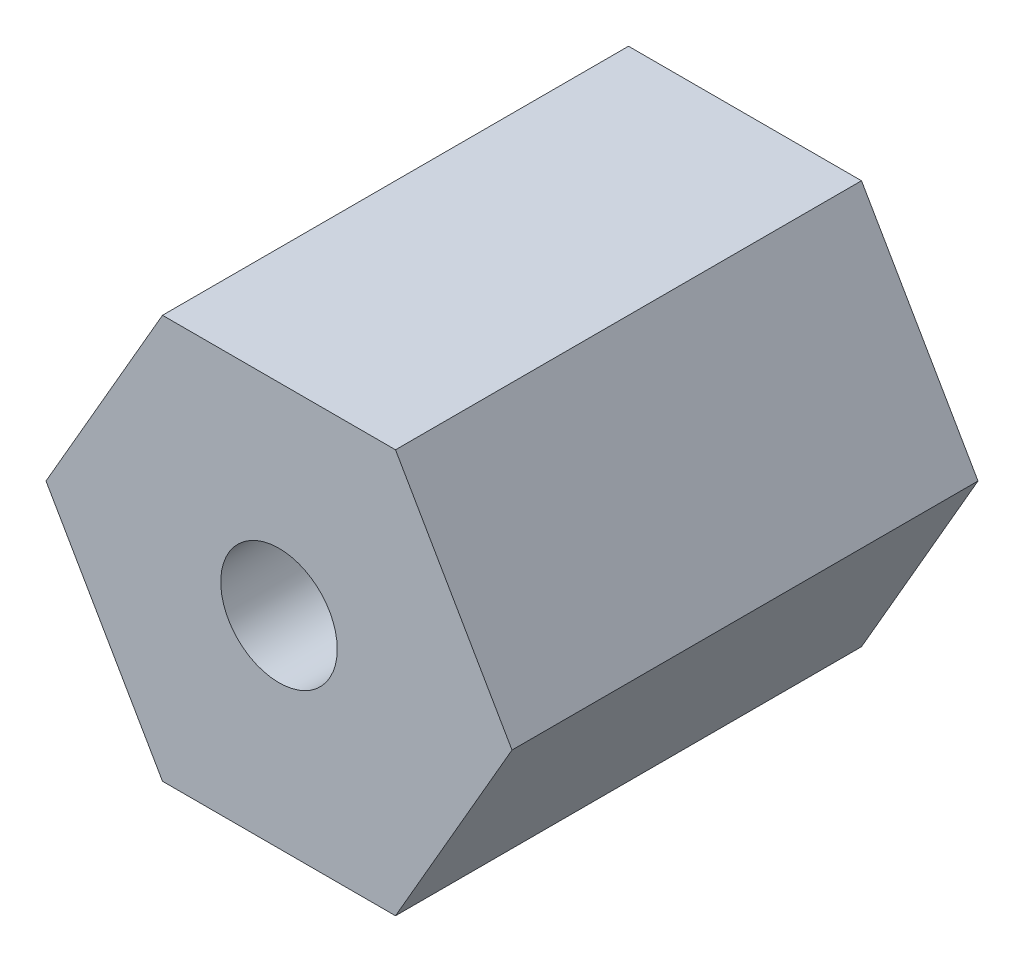
ISO-10303-21;
HEADER;
FILE_DESCRIPTION(('STEP AP214'),'2;1');
FILE_NAME('part.step','',(''),(''),'','','');
FILE_SCHEMA(('AUTOMOTIVE_DESIGN { 1 0 10303 214 1 1 1 1 }'));
ENDSEC;
DATA;
#1=APPLICATION_CONTEXT('core data for automotive mechanical design processes');
#2=APPLICATION_PROTOCOL_DEFINITION('international standard','automotive_design',2000,#1);
#3=PRODUCT_CONTEXT('',#1,'mechanical');
#4=PRODUCT('Part','Part','',(#3));
#5=PRODUCT_RELATED_PRODUCT_CATEGORY('part','',(#4));
#6=PRODUCT_DEFINITION_FORMATION('','',#4);
#7=PRODUCT_DEFINITION_CONTEXT('part definition',#1,'design');
#8=PRODUCT_DEFINITION('design','',#6,#7);
#9=PRODUCT_DEFINITION_SHAPE('','',#8);
#10=(LENGTH_UNIT() NAMED_UNIT(*) SI_UNIT(.MILLI.,.METRE.));
#11=(NAMED_UNIT(*) PLANE_ANGLE_UNIT() SI_UNIT($,.RADIAN.));
#12=(NAMED_UNIT(*) SI_UNIT($,.STERADIAN.) SOLID_ANGLE_UNIT());
#13=UNCERTAINTY_MEASURE_WITH_UNIT(LENGTH_MEASURE(1.E-05),#10,'distance_accuracy_value','');
#14=(GEOMETRIC_REPRESENTATION_CONTEXT(3) GLOBAL_UNCERTAINTY_ASSIGNED_CONTEXT((#13)) GLOBAL_UNIT_ASSIGNED_CONTEXT((#10,
#11,#12)) REPRESENTATION_CONTEXT('',''));
#15=CARTESIAN_POINT('',(0.,0.,0.));
#16=DIRECTION('',(0.,0.,1.));
#17=DIRECTION('',(1.,0.,0.));
#18=AXIS2_PLACEMENT_3D('',#15,#16,#17);
#19=CARTESIAN_POINT('',(6.,-10.3923048454133,12.));
#20=DIRECTION('',(-0.866025403784439,0.5,0.));
#21=DIRECTION('',(-0.5,-0.866025403784439,0.));
#22=AXIS2_PLACEMENT_3D('',#19,#20,#21);
#23=PLANE('',#22);
#24=DIRECTION('',(0.,0.,-1.));
#25=VECTOR('',#24,1.);
#26=CARTESIAN_POINT('',(6.,-10.3923048454133,12.));
#27=LINE('',#26,#25);
#28=CARTESIAN_POINT('',(6.,-10.3923048454133,12.));
#29=VERTEX_POINT('',#28);
#30=CARTESIAN_POINT('',(5.99999999999991,-10.3923048454133,-12.));
#31=VERTEX_POINT('',#30);
#32=EDGE_CURVE('E161',#29,#31,#27,.T.);
#33=ORIENTED_EDGE('',*,*,#32,.T.);
#34=DIRECTION('',(-0.500000000000007,-0.866025403784435,0.));
#35=VECTOR('',#34,1.);
#36=CARTESIAN_POINT('',(12.,0.,-12.));
#37=LINE('',#36,#35);
#38=CARTESIAN_POINT('',(12.,0.,-12.));
#39=VERTEX_POINT('',#38);
#40=EDGE_CURVE('E132',#39,#31,#37,.T.);
#41=ORIENTED_EDGE('',*,*,#40,.F.);
#42=DIRECTION('',(0.,0.,-1.));
#43=VECTOR('',#42,1.);
#44=CARTESIAN_POINT('',(12.,0.,12.));
#45=LINE('',#44,#43);
#46=CARTESIAN_POINT('',(12.,0.,12.));
#47=VERTEX_POINT('',#46);
#48=EDGE_CURVE('E11',#47,#39,#45,.T.);
#49=ORIENTED_EDGE('',*,*,#48,.F.);
#50=DIRECTION('',(0.5,0.866025403784439,0.));
#51=VECTOR('',#50,1.);
#52=CARTESIAN_POINT('',(6.,-10.3923048454133,12.));
#53=LINE('',#52,#51);
#54=EDGE_CURVE('E142',#29,#47,#53,.T.);
#55=ORIENTED_EDGE('',*,*,#54,.F.);
#56=EDGE_LOOP('',(#33,#41,#49,#55));
#57=FACE_BOUND('',#56,.T.);
#58=ADVANCED_FACE('F39',(#57),#23,.F.);
#59=CARTESIAN_POINT('',(12.,0.,12.));
#60=DIRECTION('',(-0.866025403784439,-0.5,0.));
#61=DIRECTION('',(0.5,-0.866025403784439,0.));
#62=AXIS2_PLACEMENT_3D('',#59,#60,#61);
#63=PLANE('',#62);
#64=ORIENTED_EDGE('',*,*,#48,.T.);
#65=DIRECTION('',(0.499999999999995,-0.866025403784442,0.));
#66=VECTOR('',#65,1.);
#67=CARTESIAN_POINT('',(6.00000000000005,10.3923048454132,-12.));
#68=LINE('',#67,#66);
#69=CARTESIAN_POINT('',(6.00000000000005,10.3923048454132,-12.));
#70=VERTEX_POINT('',#69);
#71=EDGE_CURVE('E128',#70,#39,#68,.T.);
#72=ORIENTED_EDGE('',*,*,#71,.F.);
#73=DIRECTION('',(0.,0.,-1.));
#74=VECTOR('',#73,1.);
#75=CARTESIAN_POINT('',(6.,10.3923048454133,12.));
#76=LINE('',#75,#74);
#77=CARTESIAN_POINT('',(6.,10.3923048454133,12.));
#78=VERTEX_POINT('',#77);
#79=EDGE_CURVE('E47',#78,#70,#76,.T.);
#80=ORIENTED_EDGE('',*,*,#79,.F.);
#81=DIRECTION('',(-0.5,0.866025403784439,0.));
#82=VECTOR('',#81,1.);
#83=CARTESIAN_POINT('',(12.,0.,12.));
#84=LINE('',#83,#82);
#85=EDGE_CURVE('E148',#47,#78,#84,.T.);
#86=ORIENTED_EDGE('',*,*,#85,.F.);
#87=EDGE_LOOP('',(#64,#72,#80,#86));
#88=FACE_BOUND('',#87,.T.);
#89=ADVANCED_FACE('F175',(#88),#63,.F.);
#90=CARTESIAN_POINT('',(6.,10.3923048454133,12.));
#91=DIRECTION('',(0.,-1.,0.));
#92=DIRECTION('',(0.,0.,-1.));
#93=AXIS2_PLACEMENT_3D('',#90,#91,#92);
#94=PLANE('',#93);
#95=ORIENTED_EDGE('',*,*,#79,.T.);
#96=DIRECTION('',(1.,0.,0.));
#97=VECTOR('',#96,1.);
#98=CARTESIAN_POINT('',(-5.99999999999998,10.3923048454133,-12.));
#99=LINE('',#98,#97);
#100=CARTESIAN_POINT('',(-5.99999999999998,10.3923048454133,-12.));
#101=VERTEX_POINT('',#100);
#102=EDGE_CURVE('E110',#101,#70,#99,.T.);
#103=ORIENTED_EDGE('',*,*,#102,.F.);
#104=DIRECTION('',(0.,0.,-1.));
#105=VECTOR('',#104,1.);
#106=CARTESIAN_POINT('',(-6.,10.3923048454133,12.));
#107=LINE('',#106,#105);
#108=CARTESIAN_POINT('',(-6.,10.3923048454133,12.));
#109=VERTEX_POINT('',#108);
#110=EDGE_CURVE('E99',#109,#101,#107,.T.);
#111=ORIENTED_EDGE('',*,*,#110,.F.);
#112=DIRECTION('',(-1.,0.,0.));
#113=VECTOR('',#112,1.);
#114=CARTESIAN_POINT('',(6.,10.3923048454133,12.));
#115=LINE('',#114,#113);
#116=EDGE_CURVE('E151',#78,#109,#115,.T.);
#117=ORIENTED_EDGE('',*,*,#116,.F.);
#118=EDGE_LOOP('',(#95,#103,#111,#117));
#119=FACE_BOUND('',#118,.T.);
#120=ADVANCED_FACE('F171',(#119),#94,.F.);
#121=CARTESIAN_POINT('',(-6.,10.3923048454133,12.));
#122=DIRECTION('',(0.866025403784439,-0.5,0.));
#123=DIRECTION('',(0.5,0.866025403784439,0.));
#124=AXIS2_PLACEMENT_3D('',#121,#122,#123);
#125=PLANE('',#124);
#126=ORIENTED_EDGE('',*,*,#110,.T.);
#127=DIRECTION('',(0.500000000000001,0.866025403784438,0.));
#128=VECTOR('',#127,1.);
#129=CARTESIAN_POINT('',(-12.,0.,-12.));
#130=LINE('',#129,#128);
#131=CARTESIAN_POINT('',(-12.,0.,-12.));
#132=VERTEX_POINT('',#131);
#133=EDGE_CURVE('E103',#132,#101,#130,.T.);
#134=ORIENTED_EDGE('',*,*,#133,.F.);
#135=DIRECTION('',(0.,0.,-1.));
#136=VECTOR('',#135,1.);
#137=CARTESIAN_POINT('',(-12.,0.,12.));
#138=LINE('',#137,#136);
#139=CARTESIAN_POINT('',(-12.,0.,12.));
#140=VERTEX_POINT('',#139);
#141=EDGE_CURVE('E91',#140,#132,#138,.T.);
#142=ORIENTED_EDGE('',*,*,#141,.F.);
#143=DIRECTION('',(-0.5,-0.866025403784439,0.));
#144=VECTOR('',#143,1.);
#145=CARTESIAN_POINT('',(-6.,10.3923048454133,12.));
#146=LINE('',#145,#144);
#147=EDGE_CURVE('E154',#109,#140,#146,.T.);
#148=ORIENTED_EDGE('',*,*,#147,.F.);
#149=EDGE_LOOP('',(#126,#134,#142,#148));
#150=FACE_BOUND('',#149,.T.);
#151=ADVANCED_FACE('F104',(#150),#125,.F.);
#152=CARTESIAN_POINT('',(-12.,0.,12.));
#153=DIRECTION('',(0.866025403784439,0.5,0.));
#154=DIRECTION('',(-0.5,0.866025403784439,0.));
#155=AXIS2_PLACEMENT_3D('',#152,#153,#154);
#156=PLANE('',#155);
#157=ORIENTED_EDGE('',*,*,#141,.T.);
#158=DIRECTION('',(-0.499999999999995,0.866025403784441,0.));
#159=VECTOR('',#158,1.);
#160=CARTESIAN_POINT('',(-6.00000000000012,-10.3923048454132,-12.));
#161=LINE('',#160,#159);
#162=CARTESIAN_POINT('',(-6.00000000000012,-10.3923048454132,-12.));
#163=VERTEX_POINT('',#162);
#164=EDGE_CURVE('E95',#163,#132,#161,.T.);
#165=ORIENTED_EDGE('',*,*,#164,.F.);
#166=DIRECTION('',(0.,0.,-1.));
#167=VECTOR('',#166,1.);
#168=CARTESIAN_POINT('',(-6.,-10.3923048454133,12.));
#169=LINE('',#168,#167);
#170=CARTESIAN_POINT('',(-6.,-10.3923048454133,12.));
#171=VERTEX_POINT('',#170);
#172=EDGE_CURVE('E100',#171,#163,#169,.T.);
#173=ORIENTED_EDGE('',*,*,#172,.F.);
#174=DIRECTION('',(0.5,-0.866025403784439,0.));
#175=VECTOR('',#174,1.);
#176=CARTESIAN_POINT('',(-12.,0.,12.));
#177=LINE('',#176,#175);
#178=EDGE_CURVE('E59',#140,#171,#177,.T.);
#179=ORIENTED_EDGE('',*,*,#178,.F.);
#180=EDGE_LOOP('',(#157,#165,#173,#179));
#181=FACE_BOUND('',#180,.T.);
#182=ADVANCED_FACE('F93',(#181),#156,.F.);
#183=CARTESIAN_POINT('',(-6.,-10.3923048454133,12.));
#184=DIRECTION('',(0.,1.,0.));
#185=DIRECTION('',(0.,0.,1.));
#186=AXIS2_PLACEMENT_3D('',#183,#184,#185);
#187=PLANE('',#186);
#188=ORIENTED_EDGE('',*,*,#172,.T.);
#189=DIRECTION('',(-1.,0.,0.));
#190=VECTOR('',#189,1.);
#191=CARTESIAN_POINT('',(5.99999999999991,-10.3923048454133,-12.));
#192=LINE('',#191,#190);
#193=EDGE_CURVE('E116',#31,#163,#192,.T.);
#194=ORIENTED_EDGE('',*,*,#193,.F.);
#195=ORIENTED_EDGE('',*,*,#32,.F.);
#196=DIRECTION('',(1.,0.,0.));
#197=VECTOR('',#196,1.);
#198=CARTESIAN_POINT('',(-6.,-10.3923048454133,12.));
#199=LINE('',#198,#197);
#200=EDGE_CURVE('E54',#171,#29,#199,.T.);
#201=ORIENTED_EDGE('',*,*,#200,.F.);
#202=EDGE_LOOP('',(#188,#194,#195,#201));
#203=FACE_BOUND('',#202,.T.);
#204=ADVANCED_FACE('F180',(#203),#187,.F.);
#205=CARTESIAN_POINT('',(0.,0.,12.));
#206=DIRECTION('',(0.,0.,1.));
#207=DIRECTION('',(1.,0.,0.));
#208=AXIS2_PLACEMENT_3D('',#205,#206,#207);
#209=PLANE('',#208);
#210=CARTESIAN_POINT('',(0.,0.,12.));
#211=DIRECTION('',(0.,0.,1.));
#212=DIRECTION('',(1.,0.,0.));
#213=AXIS2_PLACEMENT_3D('',#210,#211,#212);
#214=CIRCLE('',#213,3.);
#215=CARTESIAN_POINT('',(3.,0.,12.));
#216=VERTEX_POINT('',#215);
#217=EDGE_CURVE('E137',#216,#216,#214,.T.);
#218=ORIENTED_EDGE('',*,*,#217,.F.);
#219=EDGE_LOOP('',(#218));
#220=FACE_BOUND('',#219,.T.);
#221=ORIENTED_EDGE('',*,*,#54,.T.);
#222=ORIENTED_EDGE('',*,*,#85,.T.);
#223=ORIENTED_EDGE('',*,*,#116,.T.);
#224=ORIENTED_EDGE('',*,*,#147,.T.);
#225=ORIENTED_EDGE('',*,*,#178,.T.);
#226=ORIENTED_EDGE('',*,*,#200,.T.);
#227=EDGE_LOOP('',(#221,#222,#223,#224,#225,#226));
#228=FACE_BOUND('',#227,.T.);
#229=ADVANCED_FACE('F182',(#220,#228),#209,.T.);
#230=CARTESIAN_POINT('',(0.,0.,7.));
#231=DIRECTION('',(0.,0.,1.));
#232=DIRECTION('',(1.,0.,0.));
#233=AXIS2_PLACEMENT_3D('',#230,#231,#232);
#234=CYLINDRICAL_SURFACE('',#233,3.);
#235=CARTESIAN_POINT('',(0.,0.,7.));
#236=DIRECTION('',(0.,0.,1.));
#237=DIRECTION('',(1.,0.,0.));
#238=AXIS2_PLACEMENT_3D('',#235,#236,#237);
#239=CIRCLE('',#238,3.);
#240=CARTESIAN_POINT('',(3.,0.,7.));
#241=VERTEX_POINT('',#240);
#242=EDGE_CURVE('E138',#241,#241,#239,.T.);
#243=ORIENTED_EDGE('',*,*,#242,.F.);
#244=EDGE_LOOP('',(#243));
#245=FACE_BOUND('',#244,.T.);
#246=ORIENTED_EDGE('',*,*,#217,.T.);
#247=EDGE_LOOP('',(#246));
#248=FACE_BOUND('',#247,.T.);
#249=ADVANCED_FACE('F188',(#245,#248),#234,.F.);
#250=CARTESIAN_POINT('',(0.,0.,7.));
#251=DIRECTION('',(0.,0.,1.));
#252=DIRECTION('',(1.,0.,0.));
#253=AXIS2_PLACEMENT_3D('',#250,#251,#252);
#254=PLANE('',#253);
#255=ORIENTED_EDGE('',*,*,#242,.T.);
#256=EDGE_LOOP('',(#255));
#257=FACE_BOUND('',#256,.T.);
#258=ADVANCED_FACE('F226',(#257),#254,.T.);
#259=CARTESIAN_POINT('',(0.,0.,-12.));
#260=DIRECTION('',(0.,0.,-1.));
#261=DIRECTION('',(-1.,0.,0.));
#262=AXIS2_PLACEMENT_3D('',#259,#260,#261);
#263=PLANE('',#262);
#264=CARTESIAN_POINT('',(0.,0.,-12.));
#265=DIRECTION('',(0.,0.,-1.));
#266=DIRECTION('',(-1.,0.,0.));
#267=AXIS2_PLACEMENT_3D('',#264,#265,#266);
#268=CIRCLE('',#267,2.);
#269=CARTESIAN_POINT('',(-2.,0.,-12.));
#270=VERTEX_POINT('',#269);
#271=EDGE_CURVE('E122',#270,#270,#268,.T.);
#272=ORIENTED_EDGE('',*,*,#271,.F.);
#273=EDGE_LOOP('',(#272));
#274=FACE_BOUND('',#273,.T.);
#275=ORIENTED_EDGE('',*,*,#164,.T.);
#276=ORIENTED_EDGE('',*,*,#133,.T.);
#277=ORIENTED_EDGE('',*,*,#102,.T.);
#278=ORIENTED_EDGE('',*,*,#71,.T.);
#279=ORIENTED_EDGE('',*,*,#40,.T.);
#280=ORIENTED_EDGE('',*,*,#193,.T.);
#281=EDGE_LOOP('',(#275,#276,#277,#278,#279,#280));
#282=FACE_BOUND('',#281,.T.);
#283=ADVANCED_FACE('F113',(#274,#282),#263,.T.);
#284=CARTESIAN_POINT('',(0.,0.,-7.));
#285=DIRECTION('',(0.,0.,-1.));
#286=DIRECTION('',(-1.,0.,0.));
#287=AXIS2_PLACEMENT_3D('',#284,#285,#286);
#288=CYLINDRICAL_SURFACE('',#287,2.);
#289=CARTESIAN_POINT('',(0.,0.,-7.));
#290=DIRECTION('',(0.,0.,-1.));
#291=DIRECTION('',(-1.,0.,0.));
#292=AXIS2_PLACEMENT_3D('',#289,#290,#291);
#293=CIRCLE('',#292,2.);
#294=CARTESIAN_POINT('',(-2.,0.,-7.));
#295=VERTEX_POINT('',#294);
#296=EDGE_CURVE('E118',#295,#295,#293,.T.);
#297=ORIENTED_EDGE('',*,*,#296,.F.);
#298=EDGE_LOOP('',(#297));
#299=FACE_BOUND('',#298,.T.);
#300=ORIENTED_EDGE('',*,*,#271,.T.);
#301=EDGE_LOOP('',(#300));
#302=FACE_BOUND('',#301,.T.);
#303=ADVANCED_FACE('F225',(#299,#302),#288,.F.);
#304=CARTESIAN_POINT('',(0.,0.,-7.));
#305=DIRECTION('',(0.,0.,-1.));
#306=DIRECTION('',(-1.,0.,0.));
#307=AXIS2_PLACEMENT_3D('',#304,#305,#306);
#308=PLANE('',#307);
#309=ORIENTED_EDGE('',*,*,#296,.T.);
#310=EDGE_LOOP('',(#309));
#311=FACE_BOUND('',#310,.T.);
#312=ADVANCED_FACE('F237',(#311),#308,.T.);
#313=CLOSED_SHELL('',(#58,#89,#120,#151,#182,#204,#229,#249,#258,#283,#303,#312));
#314=MANIFOLD_SOLID_BREP('B2',#313);
#315=ADVANCED_BREP_SHAPE_REPRESENTATION('',(#18,#314),#14);
#316=SHAPE_DEFINITION_REPRESENTATION(#9,#315);
ENDSEC;
END-ISO-10303-21;
